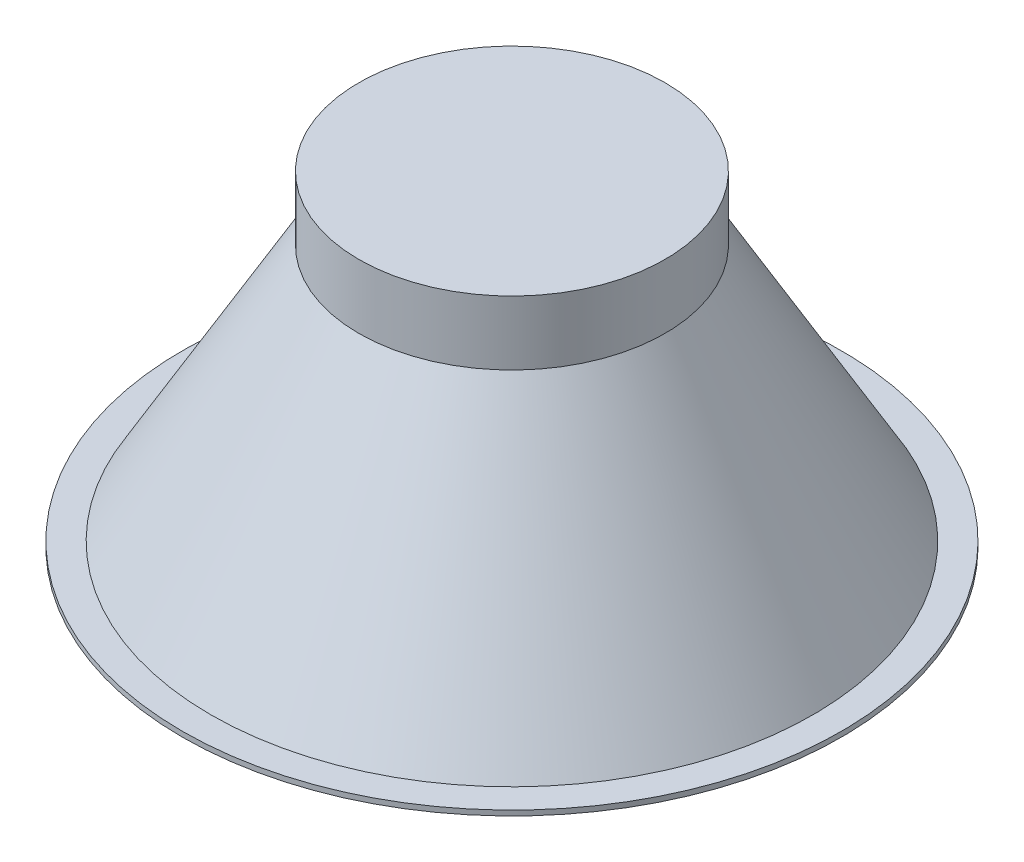
ISO-10303-21;
HEADER;
FILE_DESCRIPTION(('STEP AP214'),'2;1');
FILE_NAME('part.step','',(''),(''),'','','');
FILE_SCHEMA(('AUTOMOTIVE_DESIGN { 1 0 10303 214 1 1 1 1 }'));
ENDSEC;
DATA;
#1=APPLICATION_CONTEXT('core data for automotive mechanical design processes');
#2=APPLICATION_PROTOCOL_DEFINITION('international standard','automotive_design',2000,#1);
#3=PRODUCT_CONTEXT('',#1,'mechanical');
#4=PRODUCT('Part','Part','',(#3));
#5=PRODUCT_RELATED_PRODUCT_CATEGORY('part','',(#4));
#6=PRODUCT_DEFINITION_FORMATION('','',#4);
#7=PRODUCT_DEFINITION_CONTEXT('part definition',#1,'design');
#8=PRODUCT_DEFINITION('design','',#6,#7);
#9=PRODUCT_DEFINITION_SHAPE('','',#8);
#10=(LENGTH_UNIT() NAMED_UNIT(*) SI_UNIT(.MILLI.,.METRE.));
#11=(NAMED_UNIT(*) PLANE_ANGLE_UNIT() SI_UNIT($,.RADIAN.));
#12=(NAMED_UNIT(*) SI_UNIT($,.STERADIAN.) SOLID_ANGLE_UNIT());
#13=UNCERTAINTY_MEASURE_WITH_UNIT(LENGTH_MEASURE(1.E-05),#10,'distance_accuracy_value','');
#14=(GEOMETRIC_REPRESENTATION_CONTEXT(3) GLOBAL_UNCERTAINTY_ASSIGNED_CONTEXT((#13)) GLOBAL_UNIT_ASSIGNED_CONTEXT((#10,
#11,#12)) REPRESENTATION_CONTEXT('',''));
#15=CARTESIAN_POINT('',(0.,0.,0.));
#16=DIRECTION('',(0.,0.,1.));
#17=DIRECTION('',(1.,0.,0.));
#18=AXIS2_PLACEMENT_3D('',#15,#16,#17);
#19=CARTESIAN_POINT('',(0.,2.,0.));
#20=DIRECTION('',(0.,-1.,0.));
#21=DIRECTION('',(0.,0.,-1.));
#22=AXIS2_PLACEMENT_3D('',#19,#20,#21);
#23=CYLINDRICAL_SURFACE('',#22,128.5875);
#24=CARTESIAN_POINT('',(0.,2.,0.));
#25=DIRECTION('',(0.,1.,0.));
#26=DIRECTION('',(0.,0.,1.));
#27=AXIS2_PLACEMENT_3D('',#24,#25,#26);
#28=CIRCLE('',#27,128.5875);
#29=CARTESIAN_POINT('',(0.,2.,128.5875));
#30=VERTEX_POINT('',#29);
#31=EDGE_CURVE('E42',#30,#30,#28,.T.);
#32=ORIENTED_EDGE('',*,*,#31,.F.);
#33=EDGE_LOOP('',(#32));
#34=FACE_BOUND('',#33,.T.);
#35=CARTESIAN_POINT('',(0.,0.,0.));
#36=DIRECTION('',(0.,1.,0.));
#37=DIRECTION('',(0.,0.,1.));
#38=AXIS2_PLACEMENT_3D('',#35,#36,#37);
#39=CIRCLE('',#38,128.5875);
#40=CARTESIAN_POINT('',(0.,0.,128.5875));
#41=VERTEX_POINT('',#40);
#42=EDGE_CURVE('E38',#41,#41,#39,.T.);
#43=ORIENTED_EDGE('',*,*,#42,.T.);
#44=EDGE_LOOP('',(#43));
#45=FACE_BOUND('',#44,.T.);
#46=ADVANCED_FACE('F35',(#34,#45),#23,.T.);
#47=CARTESIAN_POINT('',(0.,2.,0.));
#48=DIRECTION('',(0.,1.,0.));
#49=DIRECTION('',(0.,0.,1.));
#50=AXIS2_PLACEMENT_3D('',#47,#48,#49);
#51=PLANE('',#50);
#52=CARTESIAN_POINT('',(0.,2.,0.));
#53=DIRECTION('',(0.,1.,0.));
#54=DIRECTION('',(0.,0.,1.));
#55=AXIS2_PLACEMENT_3D('',#52,#53,#54);
#56=CIRCLE('',#55,117.475);
#57=CARTESIAN_POINT('',(0.,2.,117.475));
#58=VERTEX_POINT('',#57);
#59=EDGE_CURVE('E10',#58,#58,#56,.T.);
#60=ORIENTED_EDGE('',*,*,#59,.F.);
#61=EDGE_LOOP('',(#60));
#62=FACE_BOUND('',#61,.T.);
#63=ORIENTED_EDGE('',*,*,#31,.T.);
#64=EDGE_LOOP('',(#63));
#65=FACE_BOUND('',#64,.T.);
#66=ADVANCED_FACE('F73',(#62,#65),#51,.T.);
#67=CARTESIAN_POINT('',(0.,0.,0.));
#68=DIRECTION('',(0.,1.,0.));
#69=DIRECTION('',(0.,0.,1.));
#70=AXIS2_PLACEMENT_3D('',#67,#68,#69);
#71=PLANE('',#70);
#72=ORIENTED_EDGE('',*,*,#42,.F.);
#73=EDGE_LOOP('',(#72));
#74=FACE_BOUND('',#73,.T.);
#75=ADVANCED_FACE('F69',(#74),#71,.F.);
#76=CARTESIAN_POINT('',(0.,2.,0.));
#77=DIRECTION('',(0.,-1.,0.));
#78=DIRECTION('',(0.,0.,1.));
#79=AXIS2_PLACEMENT_3D('',#76,#77,#78);
#80=CONICAL_SURFACE('',#79,117.475,0.5235987755983);
#81=CARTESIAN_POINT('',(0.,102.,0.));
#82=DIRECTION('',(0.,1.,0.));
#83=DIRECTION('',(0.,0.,1.));
#84=AXIS2_PLACEMENT_3D('',#81,#82,#83);
#85=CIRCLE('',#84,59.7399730810373);
#86=CARTESIAN_POINT('',(0.,102.,59.7399730810373));
#87=VERTEX_POINT('',#86);
#88=EDGE_CURVE('E50',#87,#87,#85,.T.);
#89=ORIENTED_EDGE('',*,*,#88,.F.);
#90=EDGE_LOOP('',(#89));
#91=FACE_BOUND('',#90,.T.);
#92=ORIENTED_EDGE('',*,*,#59,.T.);
#93=EDGE_LOOP('',(#92));
#94=FACE_BOUND('',#93,.T.);
#95=ADVANCED_FACE('F62',(#91,#94),#80,.T.);
#96=CARTESIAN_POINT('',(0.,127.,0.));
#97=DIRECTION('',(0.,-1.,0.));
#98=DIRECTION('',(0.,0.,-1.));
#99=AXIS2_PLACEMENT_3D('',#96,#97,#98);
#100=CYLINDRICAL_SURFACE('',#99,59.7399730810373);
#101=CARTESIAN_POINT('',(0.,127.,0.));
#102=DIRECTION('',(0.,1.,0.));
#103=DIRECTION('',(0.,0.,1.));
#104=AXIS2_PLACEMENT_3D('',#101,#102,#103);
#105=CIRCLE('',#104,59.7399730810373);
#106=CARTESIAN_POINT('',(0.,127.,59.7399730810373));
#107=VERTEX_POINT('',#106);
#108=EDGE_CURVE('E49',#107,#107,#105,.T.);
#109=ORIENTED_EDGE('',*,*,#108,.F.);
#110=EDGE_LOOP('',(#109));
#111=FACE_BOUND('',#110,.T.);
#112=ORIENTED_EDGE('',*,*,#88,.T.);
#113=EDGE_LOOP('',(#112));
#114=FACE_BOUND('',#113,.T.);
#115=ADVANCED_FACE('F60',(#111,#114),#100,.T.);
#116=CARTESIAN_POINT('',(0.,127.,0.));
#117=DIRECTION('',(0.,1.,0.));
#118=DIRECTION('',(0.,0.,1.));
#119=AXIS2_PLACEMENT_3D('',#116,#117,#118);
#120=PLANE('',#119);
#121=ORIENTED_EDGE('',*,*,#108,.T.);
#122=EDGE_LOOP('',(#121));
#123=FACE_BOUND('',#122,.T.);
#124=ADVANCED_FACE('F58',(#123),#120,.T.);
#125=CLOSED_SHELL('',(#46,#66,#75,#95,#115,#124));
#126=MANIFOLD_SOLID_BREP('B2',#125);
#127=ADVANCED_BREP_SHAPE_REPRESENTATION('',(#18,#126),#14);
#128=SHAPE_DEFINITION_REPRESENTATION(#9,#127);
ENDSEC;
END-ISO-10303-21;
